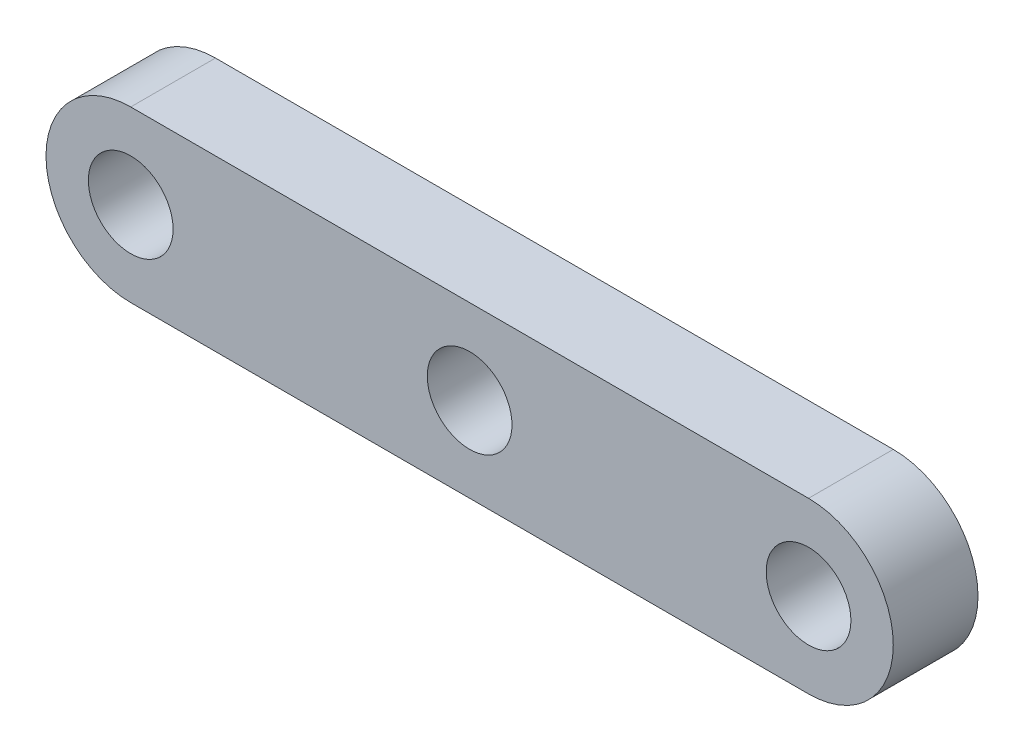
ISO-10303-21;
HEADER;
FILE_DESCRIPTION(('STEP AP214'),'2;1');
FILE_NAME('part.step','',(''),(''),'','','');
FILE_SCHEMA(('AUTOMOTIVE_DESIGN { 1 0 10303 214 1 1 1 1 }'));
ENDSEC;
DATA;
#1=APPLICATION_CONTEXT('core data for automotive mechanical design processes');
#2=APPLICATION_PROTOCOL_DEFINITION('international standard','automotive_design',2000,#1);
#3=PRODUCT_CONTEXT('',#1,'mechanical');
#4=PRODUCT('Part','Part','',(#3));
#5=PRODUCT_RELATED_PRODUCT_CATEGORY('part','',(#4));
#6=PRODUCT_DEFINITION_FORMATION('','',#4);
#7=PRODUCT_DEFINITION_CONTEXT('part definition',#1,'design');
#8=PRODUCT_DEFINITION('design','',#6,#7);
#9=PRODUCT_DEFINITION_SHAPE('','',#8);
#10=(LENGTH_UNIT() NAMED_UNIT(*) SI_UNIT(.MILLI.,.METRE.));
#11=(NAMED_UNIT(*) PLANE_ANGLE_UNIT() SI_UNIT($,.RADIAN.));
#12=(NAMED_UNIT(*) SI_UNIT($,.STERADIAN.) SOLID_ANGLE_UNIT());
#13=UNCERTAINTY_MEASURE_WITH_UNIT(LENGTH_MEASURE(1.E-05),#10,'distance_accuracy_value','');
#14=(GEOMETRIC_REPRESENTATION_CONTEXT(3) GLOBAL_UNCERTAINTY_ASSIGNED_CONTEXT((#13)) GLOBAL_UNIT_ASSIGNED_CONTEXT((#10,
#11,#12)) REPRESENTATION_CONTEXT('',''));
#15=CARTESIAN_POINT('',(0.,0.,0.));
#16=DIRECTION('',(0.,0.,1.));
#17=DIRECTION('',(1.,0.,0.));
#18=AXIS2_PLACEMENT_3D('',#15,#16,#17);
#19=CARTESIAN_POINT('',(25.4,0.,6.35));
#20=DIRECTION('',(0.,0.,-1.));
#21=DIRECTION('',(-1.,0.,0.));
#22=AXIS2_PLACEMENT_3D('',#19,#20,#21);
#23=CYLINDRICAL_SURFACE('',#22,6.35);
#24=CARTESIAN_POINT('',(25.4,0.,0.));
#25=DIRECTION('',(0.,0.,1.));
#26=DIRECTION('',(1.,0.,0.));
#27=AXIS2_PLACEMENT_3D('',#24,#25,#26);
#28=CIRCLE('',#27,6.35);
#29=CARTESIAN_POINT('',(25.4,-6.34999999999998,0.));
#30=VERTEX_POINT('',#29);
#31=CARTESIAN_POINT('',(25.4,6.35000000000002,0.));
#32=VERTEX_POINT('',#31);
#33=EDGE_CURVE('E99',#30,#32,#28,.T.);
#34=ORIENTED_EDGE('',*,*,#33,.T.);
#35=DIRECTION('',(0.,0.,-1.));
#36=VECTOR('',#35,1.);
#37=CARTESIAN_POINT('',(25.4,6.35000000000002,6.35));
#38=LINE('',#37,#36);
#39=CARTESIAN_POINT('',(25.4,6.35000000000002,6.35));
#40=VERTEX_POINT('',#39);
#41=EDGE_CURVE('E11',#40,#32,#38,.T.);
#42=ORIENTED_EDGE('',*,*,#41,.F.);
#43=CARTESIAN_POINT('',(25.4,0.,6.35));
#44=DIRECTION('',(0.,0.,1.));
#45=DIRECTION('',(1.,0.,0.));
#46=AXIS2_PLACEMENT_3D('',#43,#44,#45);
#47=CIRCLE('',#46,6.35);
#48=CARTESIAN_POINT('',(25.4,-6.34999999999998,6.35));
#49=VERTEX_POINT('',#48);
#50=EDGE_CURVE('E87',#49,#40,#47,.T.);
#51=ORIENTED_EDGE('',*,*,#50,.F.);
#52=DIRECTION('',(0.,0.,-1.));
#53=VECTOR('',#52,1.);
#54=CARTESIAN_POINT('',(25.4,-6.34999999999998,6.35));
#55=LINE('',#54,#53);
#56=EDGE_CURVE('E95',#49,#30,#55,.T.);
#57=ORIENTED_EDGE('',*,*,#56,.T.);
#58=EDGE_LOOP('',(#34,#42,#51,#57));
#59=FACE_BOUND('',#58,.T.);
#60=ADVANCED_FACE('F36',(#59),#23,.T.);
#61=CARTESIAN_POINT('',(25.4,6.35000000000002,6.35));
#62=DIRECTION('',(0.,-1.,0.));
#63=DIRECTION('',(1.,0.,0.));
#64=AXIS2_PLACEMENT_3D('',#61,#62,#63);
#65=PLANE('',#64);
#66=DIRECTION('',(-1.,0.,0.));
#67=VECTOR('',#66,1.);
#68=CARTESIAN_POINT('',(25.4,6.35000000000002,0.));
#69=LINE('',#68,#67);
#70=CARTESIAN_POINT('',(-25.4,6.35,0.));
#71=VERTEX_POINT('',#70);
#72=EDGE_CURVE('E91',#32,#71,#69,.T.);
#73=ORIENTED_EDGE('',*,*,#72,.T.);
#74=DIRECTION('',(0.,0.,-1.));
#75=VECTOR('',#74,1.);
#76=CARTESIAN_POINT('',(-25.4,6.35,6.35));
#77=LINE('',#76,#75);
#78=CARTESIAN_POINT('',(-25.4,6.35,6.35));
#79=VERTEX_POINT('',#78);
#80=EDGE_CURVE('E44',#79,#71,#77,.T.);
#81=ORIENTED_EDGE('',*,*,#80,.F.);
#82=DIRECTION('',(-1.,0.,0.));
#83=VECTOR('',#82,1.);
#84=CARTESIAN_POINT('',(25.4,6.35000000000002,6.35));
#85=LINE('',#84,#83);
#86=EDGE_CURVE('E82',#40,#79,#85,.T.);
#87=ORIENTED_EDGE('',*,*,#86,.F.);
#88=ORIENTED_EDGE('',*,*,#41,.T.);
#89=EDGE_LOOP('',(#73,#81,#87,#88));
#90=FACE_BOUND('',#89,.T.);
#91=ADVANCED_FACE('F90',(#90),#65,.F.);
#92=CARTESIAN_POINT('',(-25.4,0.,6.35));
#93=DIRECTION('',(0.,0.,-1.));
#94=DIRECTION('',(-1.,0.,0.));
#95=AXIS2_PLACEMENT_3D('',#92,#93,#94);
#96=CYLINDRICAL_SURFACE('',#95,6.35);
#97=CARTESIAN_POINT('',(-25.4,0.,0.));
#98=DIRECTION('',(0.,0.,1.));
#99=DIRECTION('',(1.,0.,0.));
#100=AXIS2_PLACEMENT_3D('',#97,#98,#99);
#101=CIRCLE('',#100,6.35);
#102=CARTESIAN_POINT('',(-25.4,-6.34999999999999,0.));
#103=VERTEX_POINT('',#102);
#104=EDGE_CURVE('E69',#71,#103,#101,.T.);
#105=ORIENTED_EDGE('',*,*,#104,.T.);
#106=DIRECTION('',(0.,0.,-1.));
#107=VECTOR('',#106,1.);
#108=CARTESIAN_POINT('',(-25.4,-6.34999999999999,6.35));
#109=LINE('',#108,#107);
#110=CARTESIAN_POINT('',(-25.4,-6.34999999999999,6.35));
#111=VERTEX_POINT('',#110);
#112=EDGE_CURVE('E92',#111,#103,#109,.T.);
#113=ORIENTED_EDGE('',*,*,#112,.F.);
#114=CARTESIAN_POINT('',(-25.4,0.,6.35));
#115=DIRECTION('',(0.,0.,1.));
#116=DIRECTION('',(1.,0.,0.));
#117=AXIS2_PLACEMENT_3D('',#114,#115,#116);
#118=CIRCLE('',#117,6.35);
#119=EDGE_CURVE('E85',#79,#111,#118,.T.);
#120=ORIENTED_EDGE('',*,*,#119,.F.);
#121=ORIENTED_EDGE('',*,*,#80,.T.);
#122=EDGE_LOOP('',(#105,#113,#120,#121));
#123=FACE_BOUND('',#122,.T.);
#124=ADVANCED_FACE('F93',(#123),#96,.T.);
#125=CARTESIAN_POINT('',(25.4,-6.34999999999998,6.35));
#126=DIRECTION('',(0.,1.,0.));
#127=DIRECTION('',(-1.,0.,0.));
#128=AXIS2_PLACEMENT_3D('',#125,#126,#127);
#129=PLANE('',#128);
#130=DIRECTION('',(1.,0.,0.));
#131=VECTOR('',#130,1.);
#132=CARTESIAN_POINT('',(25.4,-6.34999999999998,0.));
#133=LINE('',#132,#131);
#134=EDGE_CURVE('E75',#103,#30,#133,.T.);
#135=ORIENTED_EDGE('',*,*,#134,.T.);
#136=ORIENTED_EDGE('',*,*,#56,.F.);
#137=DIRECTION('',(1.,0.,0.));
#138=VECTOR('',#137,1.);
#139=CARTESIAN_POINT('',(25.4,-6.34999999999998,6.35));
#140=LINE('',#139,#138);
#141=EDGE_CURVE('E52',#111,#49,#140,.T.);
#142=ORIENTED_EDGE('',*,*,#141,.F.);
#143=ORIENTED_EDGE('',*,*,#112,.T.);
#144=EDGE_LOOP('',(#135,#136,#142,#143));
#145=FACE_BOUND('',#144,.T.);
#146=ADVANCED_FACE('F107',(#145),#129,.F.);
#147=CARTESIAN_POINT('',(25.4,0.,6.35));
#148=DIRECTION('',(0.,0.,1.));
#149=DIRECTION('',(1.,0.,0.));
#150=AXIS2_PLACEMENT_3D('',#147,#148,#149);
#151=PLANE('',#150);
#152=CARTESIAN_POINT('',(-25.4,0.,6.35));
#153=DIRECTION('',(0.,0.,1.));
#154=DIRECTION('',(1.,0.,0.));
#155=AXIS2_PLACEMENT_3D('',#152,#153,#154);
#156=CIRCLE('',#155,3.175);
#157=CARTESIAN_POINT('',(-22.225,0.,6.35));
#158=VERTEX_POINT('',#157);
#159=EDGE_CURVE('E125',#158,#158,#156,.T.);
#160=ORIENTED_EDGE('',*,*,#159,.F.);
#161=EDGE_LOOP('',(#160));
#162=FACE_BOUND('',#161,.T.);
#163=CARTESIAN_POINT('',(0.,0.,6.35));
#164=DIRECTION('',(0.,0.,1.));
#165=DIRECTION('',(1.,0.,0.));
#166=AXIS2_PLACEMENT_3D('',#163,#164,#165);
#167=CIRCLE('',#166,3.175);
#168=CARTESIAN_POINT('',(3.175,0.,6.35));
#169=VERTEX_POINT('',#168);
#170=EDGE_CURVE('E119',#169,#169,#167,.T.);
#171=ORIENTED_EDGE('',*,*,#170,.F.);
#172=EDGE_LOOP('',(#171));
#173=FACE_BOUND('',#172,.T.);
#174=CARTESIAN_POINT('',(25.4,0.,6.35));
#175=DIRECTION('',(0.,0.,1.));
#176=DIRECTION('',(1.,0.,0.));
#177=AXIS2_PLACEMENT_3D('',#174,#175,#176);
#178=CIRCLE('',#177,3.175);
#179=CARTESIAN_POINT('',(28.575,0.,6.35));
#180=VERTEX_POINT('',#179);
#181=EDGE_CURVE('E113',#180,#180,#178,.T.);
#182=ORIENTED_EDGE('',*,*,#181,.F.);
#183=EDGE_LOOP('',(#182));
#184=FACE_BOUND('',#183,.T.);
#185=ORIENTED_EDGE('',*,*,#50,.T.);
#186=ORIENTED_EDGE('',*,*,#86,.T.);
#187=ORIENTED_EDGE('',*,*,#119,.T.);
#188=ORIENTED_EDGE('',*,*,#141,.T.);
#189=EDGE_LOOP('',(#185,#186,#187,#188));
#190=FACE_BOUND('',#189,.T.);
#191=ADVANCED_FACE('F83',(#162,#173,#184,#190),#151,.T.);
#192=CARTESIAN_POINT('',(25.4,0.,0.));
#193=DIRECTION('',(0.,0.,1.));
#194=DIRECTION('',(1.,0.,0.));
#195=AXIS2_PLACEMENT_3D('',#192,#193,#194);
#196=PLANE('',#195);
#197=CARTESIAN_POINT('',(-25.4,0.,0.));
#198=DIRECTION('',(0.,0.,1.));
#199=DIRECTION('',(1.,0.,0.));
#200=AXIS2_PLACEMENT_3D('',#197,#198,#199);
#201=CIRCLE('',#200,3.175);
#202=CARTESIAN_POINT('',(-22.225,0.,0.));
#203=VERTEX_POINT('',#202);
#204=EDGE_CURVE('E102',#203,#203,#201,.T.);
#205=ORIENTED_EDGE('',*,*,#204,.T.);
#206=EDGE_LOOP('',(#205));
#207=FACE_BOUND('',#206,.T.);
#208=CARTESIAN_POINT('',(0.,0.,0.));
#209=DIRECTION('',(0.,0.,1.));
#210=DIRECTION('',(1.,0.,0.));
#211=AXIS2_PLACEMENT_3D('',#208,#209,#210);
#212=CIRCLE('',#211,3.175);
#213=CARTESIAN_POINT('',(3.175,0.,0.));
#214=VERTEX_POINT('',#213);
#215=EDGE_CURVE('E122',#214,#214,#212,.T.);
#216=ORIENTED_EDGE('',*,*,#215,.T.);
#217=EDGE_LOOP('',(#216));
#218=FACE_BOUND('',#217,.T.);
#219=CARTESIAN_POINT('',(25.4,0.,0.));
#220=DIRECTION('',(0.,0.,1.));
#221=DIRECTION('',(1.,0.,0.));
#222=AXIS2_PLACEMENT_3D('',#219,#220,#221);
#223=CIRCLE('',#222,3.175);
#224=CARTESIAN_POINT('',(28.575,0.,0.));
#225=VERTEX_POINT('',#224);
#226=EDGE_CURVE('E116',#225,#225,#223,.T.);
#227=ORIENTED_EDGE('',*,*,#226,.T.);
#228=EDGE_LOOP('',(#227));
#229=FACE_BOUND('',#228,.T.);
#230=ORIENTED_EDGE('',*,*,#33,.F.);
#231=ORIENTED_EDGE('',*,*,#134,.F.);
#232=ORIENTED_EDGE('',*,*,#104,.F.);
#233=ORIENTED_EDGE('',*,*,#72,.F.);
#234=EDGE_LOOP('',(#230,#231,#232,#233));
#235=FACE_BOUND('',#234,.T.);
#236=ADVANCED_FACE('F110',(#207,#218,#229,#235),#196,.F.);
#237=CARTESIAN_POINT('',(25.4,0.,0.));
#238=DIRECTION('',(0.,0.,1.));
#239=DIRECTION('',(1.,0.,0.));
#240=AXIS2_PLACEMENT_3D('',#237,#238,#239);
#241=CYLINDRICAL_SURFACE('',#240,3.175);
#242=ORIENTED_EDGE('',*,*,#226,.F.);
#243=EDGE_LOOP('',(#242));
#244=FACE_BOUND('',#243,.T.);
#245=ORIENTED_EDGE('',*,*,#181,.T.);
#246=EDGE_LOOP('',(#245));
#247=FACE_BOUND('',#246,.T.);
#248=ADVANCED_FACE('F147',(#244,#247),#241,.F.);
#249=CARTESIAN_POINT('',(0.,0.,0.));
#250=DIRECTION('',(0.,0.,1.));
#251=DIRECTION('',(1.,0.,0.));
#252=AXIS2_PLACEMENT_3D('',#249,#250,#251);
#253=CYLINDRICAL_SURFACE('',#252,3.175);
#254=ORIENTED_EDGE('',*,*,#215,.F.);
#255=EDGE_LOOP('',(#254));
#256=FACE_BOUND('',#255,.T.);
#257=ORIENTED_EDGE('',*,*,#170,.T.);
#258=EDGE_LOOP('',(#257));
#259=FACE_BOUND('',#258,.T.);
#260=ADVANCED_FACE('F136',(#256,#259),#253,.F.);
#261=CARTESIAN_POINT('',(-25.4,0.,0.));
#262=DIRECTION('',(0.,0.,1.));
#263=DIRECTION('',(1.,0.,0.));
#264=AXIS2_PLACEMENT_3D('',#261,#262,#263);
#265=CYLINDRICAL_SURFACE('',#264,3.175);
#266=ORIENTED_EDGE('',*,*,#204,.F.);
#267=EDGE_LOOP('',(#266));
#268=FACE_BOUND('',#267,.T.);
#269=ORIENTED_EDGE('',*,*,#159,.T.);
#270=EDGE_LOOP('',(#269));
#271=FACE_BOUND('',#270,.T.);
#272=ADVANCED_FACE('F133',(#268,#271),#265,.F.);
#273=CLOSED_SHELL('',(#60,#91,#124,#146,#191,#236,#248,#260,#272));
#274=MANIFOLD_SOLID_BREP('B2',#273);
#275=ADVANCED_BREP_SHAPE_REPRESENTATION('',(#18,#274),#14);
#276=SHAPE_DEFINITION_REPRESENTATION(#9,#275);
ENDSEC;
END-ISO-10303-21;
